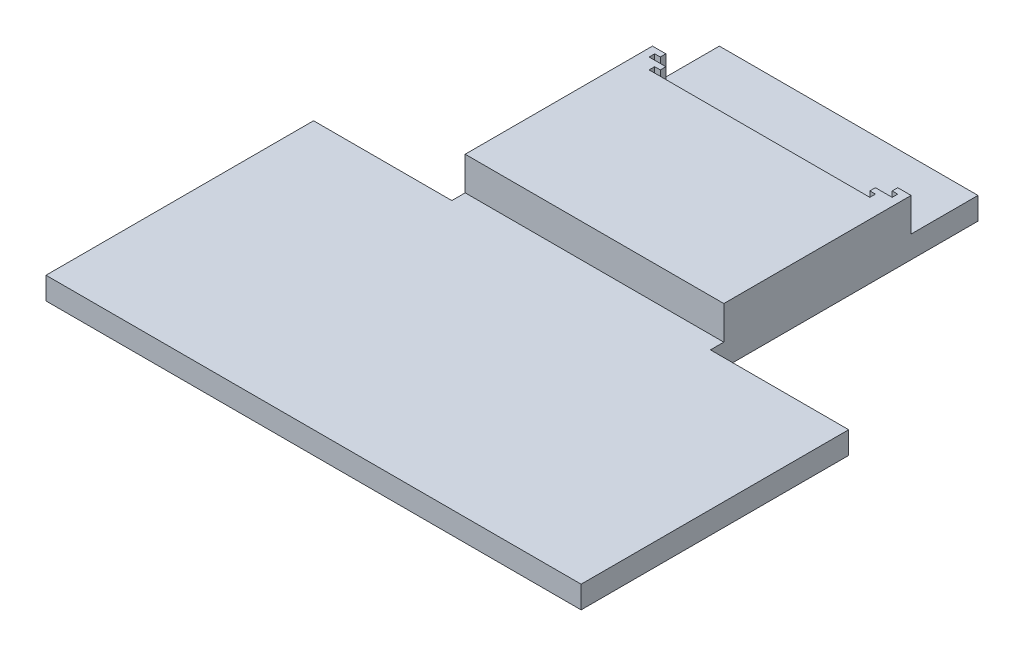
ISO-10303-21;
HEADER;
FILE_DESCRIPTION(('STEP AP214'),'2;1');
FILE_NAME('part.step','',(''),(''),'','','');
FILE_SCHEMA(('AUTOMOTIVE_DESIGN { 1 0 10303 214 1 1 1 1 }'));
ENDSEC;
DATA;
#1=APPLICATION_CONTEXT('core data for automotive mechanical design processes');
#2=APPLICATION_PROTOCOL_DEFINITION('international standard','automotive_design',2000,#1);
#3=PRODUCT_CONTEXT('',#1,'mechanical');
#4=PRODUCT('Part','Part','',(#3));
#5=PRODUCT_RELATED_PRODUCT_CATEGORY('part','',(#4));
#6=PRODUCT_DEFINITION_FORMATION('','',#4);
#7=PRODUCT_DEFINITION_CONTEXT('part definition',#1,'design');
#8=PRODUCT_DEFINITION('design','',#6,#7);
#9=PRODUCT_DEFINITION_SHAPE('','',#8);
#10=(LENGTH_UNIT() NAMED_UNIT(*) SI_UNIT(.MILLI.,.METRE.));
#11=(NAMED_UNIT(*) PLANE_ANGLE_UNIT() SI_UNIT($,.RADIAN.));
#12=(NAMED_UNIT(*) SI_UNIT($,.STERADIAN.) SOLID_ANGLE_UNIT());
#13=UNCERTAINTY_MEASURE_WITH_UNIT(LENGTH_MEASURE(1.E-05),#10,'distance_accuracy_value','');
#14=(GEOMETRIC_REPRESENTATION_CONTEXT(3) GLOBAL_UNCERTAINTY_ASSIGNED_CONTEXT((#13)) GLOBAL_UNIT_ASSIGNED_CONTEXT((#10,
#11,#12)) REPRESENTATION_CONTEXT('',''));
#15=CARTESIAN_POINT('',(0.,0.,0.));
#16=DIRECTION('',(0.,0.,1.));
#17=DIRECTION('',(1.,0.,0.));
#18=AXIS2_PLACEMENT_3D('',#15,#16,#17);
#19=CARTESIAN_POINT('',(-29.,10.,-45.));
#20=DIRECTION('',(0.,0.,1.));
#21=DIRECTION('',(1.,0.,0.));
#22=AXIS2_PLACEMENT_3D('',#19,#20,#21);
#23=PLANE('',#22);
#24=DIRECTION('',(-1.,0.,0.));
#25=VECTOR('',#24,1.);
#26=CARTESIAN_POINT('',(-29.,12.5,-45.));
#27=LINE('',#26,#25);
#28=CARTESIAN_POINT('',(-26.,12.5,-45.));
#29=VERTEX_POINT('',#28);
#30=CARTESIAN_POINT('',(-29.,12.5,-45.));
#31=VERTEX_POINT('',#30);
#32=EDGE_CURVE('E449',#29,#31,#27,.T.);
#33=ORIENTED_EDGE('',*,*,#32,.F.);
#34=DIRECTION('',(0.,1.,0.));
#35=VECTOR('',#34,1.);
#36=CARTESIAN_POINT('',(-26.,5.,-45.));
#37=LINE('',#36,#35);
#38=CARTESIAN_POINT('',(-26.,5.,-45.));
#39=VERTEX_POINT('',#38);
#40=EDGE_CURVE('E414',#39,#29,#37,.T.);
#41=ORIENTED_EDGE('',*,*,#40,.F.);
#42=DIRECTION('',(-1.,0.,0.));
#43=VECTOR('',#42,1.);
#44=CARTESIAN_POINT('',(-29.,5.,-45.));
#45=LINE('',#44,#43);
#46=CARTESIAN_POINT('',(-29.,5.,-45.));
#47=VERTEX_POINT('',#46);
#48=EDGE_CURVE('E504',#39,#47,#45,.T.);
#49=ORIENTED_EDGE('',*,*,#48,.T.);
#50=DIRECTION('',(0.,-1.,0.));
#51=VECTOR('',#50,1.);
#52=CARTESIAN_POINT('',(-29.,10.,-45.));
#53=LINE('',#52,#51);
#54=EDGE_CURVE('E509',#31,#47,#53,.T.);
#55=ORIENTED_EDGE('',*,*,#54,.F.);
#56=EDGE_LOOP('',(#33,#41,#49,#55));
#57=FACE_BOUND('',#56,.T.);
#58=ADVANCED_FACE('F45',(#57),#23,.F.);
#59=CARTESIAN_POINT('',(0.,5.,0.));
#60=DIRECTION('',(0.,1.,0.));
#61=DIRECTION('',(0.,0.,1.));
#62=AXIS2_PLACEMENT_3D('',#59,#60,#61);
#63=PLANE('',#62);
#64=CARTESIAN_POINT('',(29.,5.,-45.));
#65=VERTEX_POINT('',#64);
#66=CARTESIAN_POINT('',(26.,5.,-45.));
#67=VERTEX_POINT('',#66);
#68=EDGE_CURVE('E505',#65,#67,#45,.T.);
#69=ORIENTED_EDGE('',*,*,#68,.F.);
#70=DIRECTION('',(0.,0.,1.));
#71=VECTOR('',#70,1.);
#72=CARTESIAN_POINT('',(29.,5.,-60.));
#73=LINE('',#72,#71);
#74=CARTESIAN_POINT('',(29.,5.,-60.));
#75=VERTEX_POINT('',#74);
#76=EDGE_CURVE('E536',#75,#65,#73,.T.);
#77=ORIENTED_EDGE('',*,*,#76,.F.);
#78=DIRECTION('',(-1.,0.,0.));
#79=VECTOR('',#78,1.);
#80=CARTESIAN_POINT('',(60.,5.,-60.));
#81=LINE('',#80,#79);
#82=CARTESIAN_POINT('',(-29.,5.,-60.));
#83=VERTEX_POINT('',#82);
#84=EDGE_CURVE('E591',#75,#83,#81,.T.);
#85=ORIENTED_EDGE('',*,*,#84,.T.);
#86=DIRECTION('',(0.,0.,-1.));
#87=VECTOR('',#86,1.);
#88=CARTESIAN_POINT('',(-29.,5.,-60.));
#89=LINE('',#88,#87);
#90=EDGE_CURVE('E569',#47,#83,#89,.T.);
#91=ORIENTED_EDGE('',*,*,#90,.F.);
#92=ORIENTED_EDGE('',*,*,#48,.F.);
#93=DIRECTION('',(0.,0.,1.));
#94=VECTOR('',#93,1.);
#95=CARTESIAN_POINT('',(-26.,5.,-45.));
#96=LINE('',#95,#94);
#97=CARTESIAN_POINT('',(-26.,5.,-43.75));
#98=VERTEX_POINT('',#97);
#99=EDGE_CURVE('E313',#39,#98,#96,.T.);
#100=ORIENTED_EDGE('',*,*,#99,.T.);
#101=DIRECTION('',(-1.,0.,0.));
#102=VECTOR('',#101,1.);
#103=CARTESIAN_POINT('',(-26.,5.,-43.75));
#104=LINE('',#103,#102);
#105=CARTESIAN_POINT('',(-27.25,5.,-43.75));
#106=VERTEX_POINT('',#105);
#107=EDGE_CURVE('E317',#98,#106,#104,.T.);
#108=ORIENTED_EDGE('',*,*,#107,.T.);
#109=DIRECTION('',(0.,0.,1.));
#110=VECTOR('',#109,1.);
#111=CARTESIAN_POINT('',(-27.25,5.,-42.5));
#112=LINE('',#111,#110);
#113=CARTESIAN_POINT('',(-27.25,5.,-42.5));
#114=VERTEX_POINT('',#113);
#115=EDGE_CURVE('E321',#106,#114,#112,.T.);
#116=ORIENTED_EDGE('',*,*,#115,.T.);
#117=DIRECTION('',(1.,0.,0.));
#118=VECTOR('',#117,1.);
#119=CARTESIAN_POINT('',(-26.,5.,-42.5));
#120=LINE('',#119,#118);
#121=CARTESIAN_POINT('',(-23.5,5.,-42.5));
#122=VERTEX_POINT('',#121);
#123=EDGE_CURVE('E325',#114,#122,#120,.T.);
#124=ORIENTED_EDGE('',*,*,#123,.T.);
#125=DIRECTION('',(0.,0.,1.));
#126=VECTOR('',#125,1.);
#127=CARTESIAN_POINT('',(-23.5,5.,-41.25));
#128=LINE('',#127,#126);
#129=CARTESIAN_POINT('',(-23.5,5.,-41.25));
#130=VERTEX_POINT('',#129);
#131=EDGE_CURVE('E328',#122,#130,#128,.T.);
#132=ORIENTED_EDGE('',*,*,#131,.T.);
#133=DIRECTION('',(-1.,0.,0.));
#134=VECTOR('',#133,1.);
#135=CARTESIAN_POINT('',(-23.5,5.,-41.25));
#136=LINE('',#135,#134);
#137=CARTESIAN_POINT('',(-24.75,5.,-41.25));
#138=VERTEX_POINT('',#137);
#139=EDGE_CURVE('E332',#130,#138,#136,.T.);
#140=ORIENTED_EDGE('',*,*,#139,.T.);
#141=DIRECTION('',(0.,0.,1.));
#142=VECTOR('',#141,1.);
#143=CARTESIAN_POINT('',(-24.75,5.,-40.));
#144=LINE('',#143,#142);
#145=CARTESIAN_POINT('',(-24.75,5.,-40.));
#146=VERTEX_POINT('',#145);
#147=EDGE_CURVE('E283',#138,#146,#144,.T.);
#148=ORIENTED_EDGE('',*,*,#147,.T.);
#149=DIRECTION('',(1.,0.,0.));
#150=VECTOR('',#149,1.);
#151=CARTESIAN_POINT('',(-23.5,5.,-40.));
#152=LINE('',#151,#150);
#153=CARTESIAN_POINT('',(-21.,5.,-40.));
#154=VERTEX_POINT('',#153);
#155=EDGE_CURVE('E61',#146,#154,#152,.T.);
#156=ORIENTED_EDGE('',*,*,#155,.T.);
#157=CARTESIAN_POINT('',(21.,5.,-40.));
#158=VERTEX_POINT('',#157);
#159=EDGE_CURVE('E268',#154,#158,#152,.T.);
#160=ORIENTED_EDGE('',*,*,#159,.T.);
#161=CARTESIAN_POINT('',(24.75,5.,-40.));
#162=VERTEX_POINT('',#161);
#163=EDGE_CURVE('E261',#158,#162,#152,.T.);
#164=ORIENTED_EDGE('',*,*,#163,.T.);
#165=DIRECTION('',(0.,0.,-1.));
#166=VECTOR('',#165,1.);
#167=CARTESIAN_POINT('',(24.75,5.,-41.25));
#168=LINE('',#167,#166);
#169=CARTESIAN_POINT('',(24.75,5.,-41.25));
#170=VERTEX_POINT('',#169);
#171=EDGE_CURVE('E266',#162,#170,#168,.T.);
#172=ORIENTED_EDGE('',*,*,#171,.T.);
#173=DIRECTION('',(-1.,0.,0.));
#174=VECTOR('',#173,1.);
#175=CARTESIAN_POINT('',(23.5,5.,-41.25));
#176=LINE('',#175,#174);
#177=CARTESIAN_POINT('',(23.5,5.,-41.25));
#178=VERTEX_POINT('',#177);
#179=EDGE_CURVE('E288',#170,#178,#176,.T.);
#180=ORIENTED_EDGE('',*,*,#179,.T.);
#181=DIRECTION('',(0.,0.,-1.));
#182=VECTOR('',#181,1.);
#183=CARTESIAN_POINT('',(23.5,5.,-41.25));
#184=LINE('',#183,#182);
#185=CARTESIAN_POINT('',(23.5,5.,-42.5));
#186=VERTEX_POINT('',#185);
#187=EDGE_CURVE('E292',#178,#186,#184,.T.);
#188=ORIENTED_EDGE('',*,*,#187,.T.);
#189=DIRECTION('',(1.,0.,0.));
#190=VECTOR('',#189,1.);
#191=CARTESIAN_POINT('',(23.5,5.,-42.5));
#192=LINE('',#191,#190);
#193=CARTESIAN_POINT('',(27.25,5.,-42.5));
#194=VERTEX_POINT('',#193);
#195=EDGE_CURVE('E298',#186,#194,#192,.T.);
#196=ORIENTED_EDGE('',*,*,#195,.T.);
#197=DIRECTION('',(0.,0.,-1.));
#198=VECTOR('',#197,1.);
#199=CARTESIAN_POINT('',(27.25,5.,-43.75));
#200=LINE('',#199,#198);
#201=CARTESIAN_POINT('',(27.25,5.,-43.75));
#202=VERTEX_POINT('',#201);
#203=EDGE_CURVE('E301',#194,#202,#200,.T.);
#204=ORIENTED_EDGE('',*,*,#203,.T.);
#205=DIRECTION('',(-1.,0.,0.));
#206=VECTOR('',#205,1.);
#207=CARTESIAN_POINT('',(26.,5.,-43.75));
#208=LINE('',#207,#206);
#209=CARTESIAN_POINT('',(26.,5.,-43.75));
#210=VERTEX_POINT('',#209);
#211=EDGE_CURVE('E305',#202,#210,#208,.T.);
#212=ORIENTED_EDGE('',*,*,#211,.T.);
#213=DIRECTION('',(0.,0.,-1.));
#214=VECTOR('',#213,1.);
#215=CARTESIAN_POINT('',(26.,5.,-45.));
#216=LINE('',#215,#214);
#217=EDGE_CURVE('E309',#210,#67,#216,.T.);
#218=ORIENTED_EDGE('',*,*,#217,.T.);
#219=EDGE_LOOP('',(#69,#77,#85,#91,#92,#100,#108,#116,#124,#132,#140,#148,#156,#160,#164,#172,
#180,#188,#196,#204,#212,#218));
#220=FACE_BOUND('',#219,.T.);
#221=ADVANCED_FACE('F263',(#220),#63,.T.);
#222=CARTESIAN_POINT('',(-60.,5.,60.));
#223=DIRECTION('',(1.,0.,0.));
#224=DIRECTION('',(0.,0.,-1.));
#225=AXIS2_PLACEMENT_3D('',#222,#223,#224);
#226=PLANE('',#225);
#227=DIRECTION('',(0.,0.,1.));
#228=VECTOR('',#227,1.);
#229=CARTESIAN_POINT('',(-60.,5.,60.));
#230=LINE('',#229,#228);
#231=CARTESIAN_POINT('',(-60.,5.,0.));
#232=VERTEX_POINT('',#231);
#233=CARTESIAN_POINT('',(-60.,5.,60.));
#234=VERTEX_POINT('',#233);
#235=EDGE_CURVE('E580',#232,#234,#230,.T.);
#236=ORIENTED_EDGE('',*,*,#235,.F.);
#237=DIRECTION('',(0.,1.,0.));
#238=VECTOR('',#237,1.);
#239=CARTESIAN_POINT('',(-60.,0.,0.));
#240=LINE('',#239,#238);
#241=CARTESIAN_POINT('',(-60.,0.,0.));
#242=VERTEX_POINT('',#241);
#243=EDGE_CURVE('E554',#242,#232,#240,.T.);
#244=ORIENTED_EDGE('',*,*,#243,.F.);
#245=DIRECTION('',(0.,0.,1.));
#246=VECTOR('',#245,1.);
#247=CARTESIAN_POINT('',(-60.,0.,60.));
#248=LINE('',#247,#246);
#249=CARTESIAN_POINT('',(-60.,0.,60.));
#250=VERTEX_POINT('',#249);
#251=EDGE_CURVE('E547',#242,#250,#248,.T.);
#252=ORIENTED_EDGE('',*,*,#251,.T.);
#253=DIRECTION('',(0.,-1.,0.));
#254=VECTOR('',#253,1.);
#255=CARTESIAN_POINT('',(-60.,5.,60.));
#256=LINE('',#255,#254);
#257=EDGE_CURVE('E11',#234,#250,#256,.T.);
#258=ORIENTED_EDGE('',*,*,#257,.F.);
#259=EDGE_LOOP('',(#236,#244,#252,#258));
#260=FACE_BOUND('',#259,.T.);
#261=ADVANCED_FACE('F47',(#260),#226,.F.);
#262=CARTESIAN_POINT('',(60.,5.,60.));
#263=DIRECTION('',(0.,0.,-1.));
#264=DIRECTION('',(-1.,0.,0.));
#265=AXIS2_PLACEMENT_3D('',#262,#263,#264);
#266=PLANE('',#265);
#267=DIRECTION('',(1.,0.,0.));
#268=VECTOR('',#267,1.);
#269=CARTESIAN_POINT('',(60.,0.,60.));
#270=LINE('',#269,#268);
#271=CARTESIAN_POINT('',(60.,0.,60.));
#272=VERTEX_POINT('',#271);
#273=EDGE_CURVE('E597',#250,#272,#270,.T.);
#274=ORIENTED_EDGE('',*,*,#273,.T.);
#275=DIRECTION('',(0.,-1.,0.));
#276=VECTOR('',#275,1.);
#277=CARTESIAN_POINT('',(60.,5.,60.));
#278=LINE('',#277,#276);
#279=CARTESIAN_POINT('',(60.,5.,60.));
#280=VERTEX_POINT('',#279);
#281=EDGE_CURVE('E54',#280,#272,#278,.T.);
#282=ORIENTED_EDGE('',*,*,#281,.F.);
#283=DIRECTION('',(1.,0.,0.));
#284=VECTOR('',#283,1.);
#285=CARTESIAN_POINT('',(60.,5.,60.));
#286=LINE('',#285,#284);
#287=EDGE_CURVE('E583',#234,#280,#286,.T.);
#288=ORIENTED_EDGE('',*,*,#287,.F.);
#289=ORIENTED_EDGE('',*,*,#257,.T.);
#290=EDGE_LOOP('',(#274,#282,#288,#289));
#291=FACE_BOUND('',#290,.T.);
#292=ADVANCED_FACE('F1046',(#291),#266,.F.);
#293=CARTESIAN_POINT('',(60.,5.,60.));
#294=DIRECTION('',(-1.,0.,0.));
#295=DIRECTION('',(0.,0.,1.));
#296=AXIS2_PLACEMENT_3D('',#293,#294,#295);
#297=PLANE('',#296);
#298=DIRECTION('',(0.,0.,-1.));
#299=VECTOR('',#298,1.);
#300=CARTESIAN_POINT('',(60.,0.,60.));
#301=LINE('',#300,#299);
#302=CARTESIAN_POINT('',(60.,0.,0.));
#303=VERTEX_POINT('',#302);
#304=EDGE_CURVE('E600',#272,#303,#301,.T.);
#305=ORIENTED_EDGE('',*,*,#304,.T.);
#306=DIRECTION('',(0.,1.,0.));
#307=VECTOR('',#306,1.);
#308=CARTESIAN_POINT('',(60.,0.,0.));
#309=LINE('',#308,#307);
#310=CARTESIAN_POINT('',(60.,5.,0.));
#311=VERTEX_POINT('',#310);
#312=EDGE_CURVE('E543',#303,#311,#309,.T.);
#313=ORIENTED_EDGE('',*,*,#312,.T.);
#314=DIRECTION('',(0.,0.,-1.));
#315=VECTOR('',#314,1.);
#316=CARTESIAN_POINT('',(60.,5.,60.));
#317=LINE('',#316,#315);
#318=EDGE_CURVE('E587',#280,#311,#317,.T.);
#319=ORIENTED_EDGE('',*,*,#318,.F.);
#320=ORIENTED_EDGE('',*,*,#281,.T.);
#321=EDGE_LOOP('',(#305,#313,#319,#320));
#322=FACE_BOUND('',#321,.T.);
#323=ADVANCED_FACE('F612',(#322),#297,.F.);
#324=CARTESIAN_POINT('',(60.,5.,-60.));
#325=DIRECTION('',(0.,0.,1.));
#326=DIRECTION('',(1.,0.,0.));
#327=AXIS2_PLACEMENT_3D('',#324,#325,#326);
#328=PLANE('',#327);
#329=ORIENTED_EDGE('',*,*,#84,.F.);
#330=DIRECTION('',(0.,1.,0.));
#331=VECTOR('',#330,1.);
#332=CARTESIAN_POINT('',(29.,0.,-60.));
#333=LINE('',#332,#331);
#334=CARTESIAN_POINT('',(29.,0.,-60.));
#335=VERTEX_POINT('',#334);
#336=EDGE_CURVE('E535',#335,#75,#333,.T.);
#337=ORIENTED_EDGE('',*,*,#336,.F.);
#338=DIRECTION('',(-1.,0.,0.));
#339=VECTOR('',#338,1.);
#340=CARTESIAN_POINT('',(60.,0.,-60.));
#341=LINE('',#340,#339);
#342=CARTESIAN_POINT('',(-29.,0.,-60.));
#343=VERTEX_POINT('',#342);
#344=EDGE_CURVE('E584',#335,#343,#341,.T.);
#345=ORIENTED_EDGE('',*,*,#344,.T.);
#346=DIRECTION('',(0.,1.,0.));
#347=VECTOR('',#346,1.);
#348=CARTESIAN_POINT('',(-29.,0.,-60.));
#349=LINE('',#348,#347);
#350=EDGE_CURVE('E525',#343,#83,#349,.T.);
#351=ORIENTED_EDGE('',*,*,#350,.T.);
#352=EDGE_LOOP('',(#329,#337,#345,#351));
#353=FACE_BOUND('',#352,.T.);
#354=ADVANCED_FACE('F704',(#353),#328,.F.);
#355=DIRECTION('',(1.,0.,0.));
#356=VECTOR('',#355,1.);
#357=CARTESIAN_POINT('',(-29.,5.,-2.99999999999997));
#358=LINE('',#357,#356);
#359=CARTESIAN_POINT('',(-29.,5.,-2.99999999999997));
#360=VERTEX_POINT('',#359);
#361=CARTESIAN_POINT('',(29.,5.,-2.99999999999997));
#362=VERTEX_POINT('',#361);
#363=EDGE_CURVE('E500',#360,#362,#358,.T.);
#364=ORIENTED_EDGE('',*,*,#363,.F.);
#365=CARTESIAN_POINT('',(-29.,5.,0.));
#366=VERTEX_POINT('',#365);
#367=EDGE_CURVE('E564',#366,#360,#89,.T.);
#368=ORIENTED_EDGE('',*,*,#367,.F.);
#369=DIRECTION('',(1.,0.,0.));
#370=VECTOR('',#369,1.);
#371=CARTESIAN_POINT('',(-60.,5.,0.));
#372=LINE('',#371,#370);
#373=EDGE_CURVE('E568',#232,#366,#372,.T.);
#374=ORIENTED_EDGE('',*,*,#373,.F.);
#375=ORIENTED_EDGE('',*,*,#235,.T.);
#376=ORIENTED_EDGE('',*,*,#287,.T.);
#377=ORIENTED_EDGE('',*,*,#318,.T.);
#378=DIRECTION('',(1.,0.,0.));
#379=VECTOR('',#378,1.);
#380=CARTESIAN_POINT('',(60.,5.,0.));
#381=LINE('',#380,#379);
#382=CARTESIAN_POINT('',(29.,5.,0.));
#383=VERTEX_POINT('',#382);
#384=EDGE_CURVE('E531',#383,#311,#381,.T.);
#385=ORIENTED_EDGE('',*,*,#384,.F.);
#386=EDGE_CURVE('E540',#362,#383,#73,.T.);
#387=ORIENTED_EDGE('',*,*,#386,.F.);
#388=EDGE_LOOP('',(#364,#368,#374,#375,#376,#377,#385,#387));
#389=FACE_BOUND('',#388,.T.);
#390=ADVANCED_FACE('F711',(#389),#63,.T.);
#391=CARTESIAN_POINT('',(0.,0.,0.));
#392=DIRECTION('',(0.,1.,0.));
#393=DIRECTION('',(0.,0.,1.));
#394=AXIS2_PLACEMENT_3D('',#391,#392,#393);
#395=PLANE('',#394);
#396=DIRECTION('',(0.,0.,1.));
#397=VECTOR('',#396,1.);
#398=CARTESIAN_POINT('',(29.,0.,-60.));
#399=LINE('',#398,#397);
#400=CARTESIAN_POINT('',(29.,0.,0.));
#401=VERTEX_POINT('',#400);
#402=EDGE_CURVE('E526',#335,#401,#399,.T.);
#403=ORIENTED_EDGE('',*,*,#402,.T.);
#404=DIRECTION('',(1.,0.,0.));
#405=VECTOR('',#404,1.);
#406=CARTESIAN_POINT('',(60.,0.,0.));
#407=LINE('',#406,#405);
#408=EDGE_CURVE('E530',#401,#303,#407,.T.);
#409=ORIENTED_EDGE('',*,*,#408,.T.);
#410=ORIENTED_EDGE('',*,*,#304,.F.);
#411=ORIENTED_EDGE('',*,*,#273,.F.);
#412=ORIENTED_EDGE('',*,*,#251,.F.);
#413=DIRECTION('',(1.,0.,0.));
#414=VECTOR('',#413,1.);
#415=CARTESIAN_POINT('',(-60.,0.,0.));
#416=LINE('',#415,#414);
#417=CARTESIAN_POINT('',(-29.,0.,0.));
#418=VERTEX_POINT('',#417);
#419=EDGE_CURVE('E576',#242,#418,#416,.T.);
#420=ORIENTED_EDGE('',*,*,#419,.T.);
#421=DIRECTION('',(0.,0.,-1.));
#422=VECTOR('',#421,1.);
#423=CARTESIAN_POINT('',(-29.,0.,-60.));
#424=LINE('',#423,#422);
#425=EDGE_CURVE('E557',#418,#343,#424,.T.);
#426=ORIENTED_EDGE('',*,*,#425,.T.);
#427=ORIENTED_EDGE('',*,*,#344,.F.);
#428=EDGE_LOOP('',(#403,#409,#410,#411,#412,#420,#426,#427));
#429=FACE_BOUND('',#428,.T.);
#430=ADVANCED_FACE('F617',(#429),#395,.F.);
#431=CARTESIAN_POINT('',(-29.,0.,-60.));
#432=DIRECTION('',(1.,0.,0.));
#433=DIRECTION('',(0.,0.,-1.));
#434=AXIS2_PLACEMENT_3D('',#431,#432,#433);
#435=PLANE('',#434);
#436=ORIENTED_EDGE('',*,*,#367,.T.);
#437=DIRECTION('',(0.,-1.,0.));
#438=VECTOR('',#437,1.);
#439=CARTESIAN_POINT('',(-29.,10.,-2.99999999999997));
#440=LINE('',#439,#438);
#441=CARTESIAN_POINT('',(-29.,12.5,-2.99999999999997));
#442=VERTEX_POINT('',#441);
#443=EDGE_CURVE('E521',#442,#360,#440,.T.);
#444=ORIENTED_EDGE('',*,*,#443,.F.);
#445=DIRECTION('',(0.,0.,1.));
#446=VECTOR('',#445,1.);
#447=CARTESIAN_POINT('',(-29.,12.5,-45.));
#448=LINE('',#447,#446);
#449=EDGE_CURVE('E395',#31,#442,#448,.T.);
#450=ORIENTED_EDGE('',*,*,#449,.F.);
#451=ORIENTED_EDGE('',*,*,#54,.T.);
#452=ORIENTED_EDGE('',*,*,#90,.T.);
#453=ORIENTED_EDGE('',*,*,#350,.F.);
#454=ORIENTED_EDGE('',*,*,#425,.F.);
#455=DIRECTION('',(0.,1.,0.));
#456=VECTOR('',#455,1.);
#457=CARTESIAN_POINT('',(-29.,0.,0.));
#458=LINE('',#457,#456);
#459=EDGE_CURVE('E558',#418,#366,#458,.T.);
#460=ORIENTED_EDGE('',*,*,#459,.T.);
#461=EDGE_LOOP('',(#436,#444,#450,#451,#452,#453,#454,#460));
#462=FACE_BOUND('',#461,.T.);
#463=ADVANCED_FACE('F647',(#462),#435,.F.);
#464=CARTESIAN_POINT('',(-60.,0.,0.));
#465=DIRECTION('',(0.,0.,1.));
#466=DIRECTION('',(1.,0.,0.));
#467=AXIS2_PLACEMENT_3D('',#464,#465,#466);
#468=PLANE('',#467);
#469=ORIENTED_EDGE('',*,*,#373,.T.);
#470=ORIENTED_EDGE('',*,*,#459,.F.);
#471=ORIENTED_EDGE('',*,*,#419,.F.);
#472=ORIENTED_EDGE('',*,*,#243,.T.);
#473=EDGE_LOOP('',(#469,#470,#471,#472));
#474=FACE_BOUND('',#473,.T.);
#475=ADVANCED_FACE('F707',(#474),#468,.F.);
#476=CARTESIAN_POINT('',(60.,0.,0.));
#477=DIRECTION('',(0.,0.,1.));
#478=DIRECTION('',(1.,0.,0.));
#479=AXIS2_PLACEMENT_3D('',#476,#477,#478);
#480=PLANE('',#479);
#481=ORIENTED_EDGE('',*,*,#384,.T.);
#482=ORIENTED_EDGE('',*,*,#312,.F.);
#483=ORIENTED_EDGE('',*,*,#408,.F.);
#484=DIRECTION('',(0.,1.,0.));
#485=VECTOR('',#484,1.);
#486=CARTESIAN_POINT('',(29.,0.,0.));
#487=LINE('',#486,#485);
#488=EDGE_CURVE('E548',#401,#383,#487,.T.);
#489=ORIENTED_EDGE('',*,*,#488,.T.);
#490=EDGE_LOOP('',(#481,#482,#483,#489));
#491=FACE_BOUND('',#490,.T.);
#492=ADVANCED_FACE('F622',(#491),#480,.F.);
#493=CARTESIAN_POINT('',(29.,0.,-60.));
#494=DIRECTION('',(-1.,0.,0.));
#495=DIRECTION('',(0.,0.,1.));
#496=AXIS2_PLACEMENT_3D('',#493,#494,#495);
#497=PLANE('',#496);
#498=ORIENTED_EDGE('',*,*,#76,.T.);
#499=DIRECTION('',(0.,-1.,0.));
#500=VECTOR('',#499,1.);
#501=CARTESIAN_POINT('',(29.,10.,-45.));
#502=LINE('',#501,#500);
#503=CARTESIAN_POINT('',(29.,12.5,-45.));
#504=VERTEX_POINT('',#503);
#505=EDGE_CURVE('E513',#504,#65,#502,.T.);
#506=ORIENTED_EDGE('',*,*,#505,.F.);
#507=DIRECTION('',(0.,0.,-1.));
#508=VECTOR('',#507,1.);
#509=CARTESIAN_POINT('',(29.,12.5,-45.));
#510=LINE('',#509,#508);
#511=CARTESIAN_POINT('',(29.,12.5,-2.99999999999997));
#512=VERTEX_POINT('',#511);
#513=EDGE_CURVE('E445',#512,#504,#510,.T.);
#514=ORIENTED_EDGE('',*,*,#513,.F.);
#515=DIRECTION('',(0.,-1.,0.));
#516=VECTOR('',#515,1.);
#517=CARTESIAN_POINT('',(29.,10.,-2.99999999999997));
#518=LINE('',#517,#516);
#519=EDGE_CURVE('E517',#512,#362,#518,.T.);
#520=ORIENTED_EDGE('',*,*,#519,.T.);
#521=ORIENTED_EDGE('',*,*,#386,.T.);
#522=ORIENTED_EDGE('',*,*,#488,.F.);
#523=ORIENTED_EDGE('',*,*,#402,.F.);
#524=ORIENTED_EDGE('',*,*,#336,.T.);
#525=EDGE_LOOP('',(#498,#506,#514,#520,#521,#522,#523,#524));
#526=FACE_BOUND('',#525,.T.);
#527=ADVANCED_FACE('F625',(#526),#497,.F.);
#528=CARTESIAN_POINT('',(-29.,10.,-2.99999999999997));
#529=DIRECTION('',(0.,0.,-1.));
#530=DIRECTION('',(-1.,0.,0.));
#531=AXIS2_PLACEMENT_3D('',#528,#529,#530);
#532=PLANE('',#531);
#533=ORIENTED_EDGE('',*,*,#363,.T.);
#534=ORIENTED_EDGE('',*,*,#519,.F.);
#535=DIRECTION('',(1.,0.,0.));
#536=VECTOR('',#535,1.);
#537=CARTESIAN_POINT('',(-29.,12.5,-2.99999999999997));
#538=LINE('',#537,#536);
#539=EDGE_CURVE('E441',#442,#512,#538,.T.);
#540=ORIENTED_EDGE('',*,*,#539,.F.);
#541=ORIENTED_EDGE('',*,*,#443,.T.);
#542=EDGE_LOOP('',(#533,#534,#540,#541));
#543=FACE_BOUND('',#542,.T.);
#544=ADVANCED_FACE('F651',(#543),#532,.F.);
#545=ORIENTED_EDGE('',*,*,#68,.T.);
#546=DIRECTION('',(0.,1.,0.));
#547=VECTOR('',#546,1.);
#548=CARTESIAN_POINT('',(26.,5.,-45.));
#549=LINE('',#548,#547);
#550=CARTESIAN_POINT('',(26.,12.5,-45.));
#551=VERTEX_POINT('',#550);
#552=EDGE_CURVE('E417',#67,#551,#549,.T.);
#553=ORIENTED_EDGE('',*,*,#552,.T.);
#554=EDGE_CURVE('E450',#504,#551,#27,.T.);
#555=ORIENTED_EDGE('',*,*,#554,.F.);
#556=ORIENTED_EDGE('',*,*,#505,.T.);
#557=EDGE_LOOP('',(#545,#553,#555,#556));
#558=FACE_BOUND('',#557,.T.);
#559=ADVANCED_FACE('F655',(#558),#23,.F.);
#560=CARTESIAN_POINT('',(0.,12.5,0.));
#561=DIRECTION('',(0.,1.,0.));
#562=DIRECTION('',(0.,0.,1.));
#563=AXIS2_PLACEMENT_3D('',#560,#561,#562);
#564=PLANE('',#563);
#565=DIRECTION('',(0.,0.,1.));
#566=VECTOR('',#565,1.);
#567=CARTESIAN_POINT('',(-26.,12.5,-45.));
#568=LINE('',#567,#566);
#569=CARTESIAN_POINT('',(-26.,12.5,-43.75));
#570=VERTEX_POINT('',#569);
#571=EDGE_CURVE('E366',#29,#570,#568,.T.);
#572=ORIENTED_EDGE('',*,*,#571,.F.);
#573=ORIENTED_EDGE('',*,*,#32,.T.);
#574=ORIENTED_EDGE('',*,*,#449,.T.);
#575=ORIENTED_EDGE('',*,*,#539,.T.);
#576=ORIENTED_EDGE('',*,*,#513,.T.);
#577=ORIENTED_EDGE('',*,*,#554,.T.);
#578=DIRECTION('',(0.,0.,-1.));
#579=VECTOR('',#578,1.);
#580=CARTESIAN_POINT('',(26.,12.5,-45.));
#581=LINE('',#580,#579);
#582=CARTESIAN_POINT('',(26.,12.5,-43.75));
#583=VERTEX_POINT('',#582);
#584=EDGE_CURVE('E363',#583,#551,#581,.T.);
#585=ORIENTED_EDGE('',*,*,#584,.F.);
#586=DIRECTION('',(-1.,0.,0.));
#587=VECTOR('',#586,1.);
#588=CARTESIAN_POINT('',(26.,12.5,-43.75));
#589=LINE('',#588,#587);
#590=CARTESIAN_POINT('',(27.25,12.5,-43.75));
#591=VERTEX_POINT('',#590);
#592=EDGE_CURVE('E359',#591,#583,#589,.T.);
#593=ORIENTED_EDGE('',*,*,#592,.F.);
#594=DIRECTION('',(0.,0.,-1.));
#595=VECTOR('',#594,1.);
#596=CARTESIAN_POINT('',(27.25,12.5,-43.75));
#597=LINE('',#596,#595);
#598=CARTESIAN_POINT('',(27.25,12.5,-42.5));
#599=VERTEX_POINT('',#598);
#600=EDGE_CURVE('E355',#599,#591,#597,.T.);
#601=ORIENTED_EDGE('',*,*,#600,.F.);
#602=DIRECTION('',(1.,0.,0.));
#603=VECTOR('',#602,1.);
#604=CARTESIAN_POINT('',(26.,12.5,-42.5));
#605=LINE('',#604,#603);
#606=CARTESIAN_POINT('',(23.5,12.5,-42.5));
#607=VERTEX_POINT('',#606);
#608=EDGE_CURVE('E351',#607,#599,#605,.T.);
#609=ORIENTED_EDGE('',*,*,#608,.F.);
#610=DIRECTION('',(0.,0.,-1.));
#611=VECTOR('',#610,1.);
#612=CARTESIAN_POINT('',(23.5,12.5,-41.25));
#613=LINE('',#612,#611);
#614=CARTESIAN_POINT('',(23.5,12.5,-41.25));
#615=VERTEX_POINT('',#614);
#616=EDGE_CURVE('E347',#615,#607,#613,.T.);
#617=ORIENTED_EDGE('',*,*,#616,.F.);
#618=DIRECTION('',(-1.,0.,0.));
#619=VECTOR('',#618,1.);
#620=CARTESIAN_POINT('',(23.5,12.5,-41.25));
#621=LINE('',#620,#619);
#622=CARTESIAN_POINT('',(24.75,12.5,-41.25));
#623=VERTEX_POINT('',#622);
#624=EDGE_CURVE('E343',#623,#615,#621,.T.);
#625=ORIENTED_EDGE('',*,*,#624,.F.);
#626=DIRECTION('',(0.,0.,-1.));
#627=VECTOR('',#626,1.);
#628=CARTESIAN_POINT('',(24.75,12.5,-41.25));
#629=LINE('',#628,#627);
#630=CARTESIAN_POINT('',(24.75,12.5,-40.));
#631=VERTEX_POINT('',#630);
#632=EDGE_CURVE('E340',#631,#623,#629,.T.);
#633=ORIENTED_EDGE('',*,*,#632,.F.);
#634=DIRECTION('',(1.,0.,0.));
#635=VECTOR('',#634,1.);
#636=CARTESIAN_POINT('',(23.5,12.5,-40.));
#637=LINE('',#636,#635);
#638=CARTESIAN_POINT('',(-24.75,12.5,-39.9999999999997));
#639=VERTEX_POINT('',#638);
#640=EDGE_CURVE('E277',#639,#631,#637,.T.);
#641=ORIENTED_EDGE('',*,*,#640,.F.);
#642=DIRECTION('',(0.,0.,1.));
#643=VECTOR('',#642,1.);
#644=CARTESIAN_POINT('',(-24.75,12.5,-40.));
#645=LINE('',#644,#643);
#646=CARTESIAN_POINT('',(-24.75,12.5,-41.25));
#647=VERTEX_POINT('',#646);
#648=EDGE_CURVE('E69',#647,#639,#645,.T.);
#649=ORIENTED_EDGE('',*,*,#648,.F.);
#650=DIRECTION('',(-1.,0.,0.));
#651=VECTOR('',#650,1.);
#652=CARTESIAN_POINT('',(-23.5,12.5,-41.25));
#653=LINE('',#652,#651);
#654=CARTESIAN_POINT('',(-23.5,12.5,-41.25));
#655=VERTEX_POINT('',#654);
#656=EDGE_CURVE('E386',#655,#647,#653,.T.);
#657=ORIENTED_EDGE('',*,*,#656,.F.);
#658=DIRECTION('',(0.,0.,1.));
#659=VECTOR('',#658,1.);
#660=CARTESIAN_POINT('',(-23.5,12.5,-41.25));
#661=LINE('',#660,#659);
#662=CARTESIAN_POINT('',(-23.5,12.5,-42.5));
#663=VERTEX_POINT('',#662);
#664=EDGE_CURVE('E382',#663,#655,#661,.T.);
#665=ORIENTED_EDGE('',*,*,#664,.F.);
#666=DIRECTION('',(1.,0.,0.));
#667=VECTOR('',#666,1.);
#668=CARTESIAN_POINT('',(-26.,12.5,-42.5));
#669=LINE('',#668,#667);
#670=CARTESIAN_POINT('',(-27.25,12.5,-42.5));
#671=VERTEX_POINT('',#670);
#672=EDGE_CURVE('E378',#671,#663,#669,.T.);
#673=ORIENTED_EDGE('',*,*,#672,.F.);
#674=DIRECTION('',(0.,0.,1.));
#675=VECTOR('',#674,1.);
#676=CARTESIAN_POINT('',(-27.25,12.5,-42.5));
#677=LINE('',#676,#675);
#678=CARTESIAN_POINT('',(-27.25,12.5,-43.75));
#679=VERTEX_POINT('',#678);
#680=EDGE_CURVE('E374',#679,#671,#677,.T.);
#681=ORIENTED_EDGE('',*,*,#680,.F.);
#682=DIRECTION('',(-1.,0.,0.));
#683=VECTOR('',#682,1.);
#684=CARTESIAN_POINT('',(-26.,12.5,-43.75));
#685=LINE('',#684,#683);
#686=EDGE_CURVE('E370',#570,#679,#685,.T.);
#687=ORIENTED_EDGE('',*,*,#686,.F.);
#688=EDGE_LOOP('',(#572,#573,#574,#575,#576,#577,#585,#593,#601,#609,#617,#625,#633,#641,#649,
#657,#665,#673,#681,#687));
#689=FACE_BOUND('',#688,.T.);
#690=ADVANCED_FACE('F639',(#689),#564,.T.);
#691=CARTESIAN_POINT('',(-24.75,5.,-40.));
#692=DIRECTION('',(-1.,0.,0.));
#693=DIRECTION('',(0.,0.,1.));
#694=AXIS2_PLACEMENT_3D('',#691,#692,#693);
#695=PLANE('',#694);
#696=ORIENTED_EDGE('',*,*,#648,.T.);
#697=DIRECTION('',(0.,1.,0.));
#698=VECTOR('',#697,1.);
#699=CARTESIAN_POINT('',(-24.75,5.,-40.));
#700=LINE('',#699,#698);
#701=EDGE_CURVE('E392',#146,#639,#700,.T.);
#702=ORIENTED_EDGE('',*,*,#701,.F.);
#703=ORIENTED_EDGE('',*,*,#147,.F.);
#704=DIRECTION('',(0.,1.,0.));
#705=VECTOR('',#704,1.);
#706=CARTESIAN_POINT('',(-24.75,5.,-41.25));
#707=LINE('',#706,#705);
#708=EDGE_CURVE('E396',#138,#647,#707,.T.);
#709=ORIENTED_EDGE('',*,*,#708,.T.);
#710=EDGE_LOOP('',(#696,#702,#703,#709));
#711=FACE_BOUND('',#710,.T.);
#712=ADVANCED_FACE('F735',(#711),#695,.F.);
#713=CARTESIAN_POINT('',(-23.5,5.,-41.25));
#714=DIRECTION('',(0.,0.,-1.));
#715=DIRECTION('',(-1.,0.,0.));
#716=AXIS2_PLACEMENT_3D('',#713,#714,#715);
#717=PLANE('',#716);
#718=ORIENTED_EDGE('',*,*,#656,.T.);
#719=ORIENTED_EDGE('',*,*,#708,.F.);
#720=ORIENTED_EDGE('',*,*,#139,.F.);
#721=DIRECTION('',(0.,1.,0.));
#722=VECTOR('',#721,1.);
#723=CARTESIAN_POINT('',(-23.5,5.,-41.25));
#724=LINE('',#723,#722);
#725=EDGE_CURVE('E399',#130,#655,#724,.T.);
#726=ORIENTED_EDGE('',*,*,#725,.T.);
#727=EDGE_LOOP('',(#718,#719,#720,#726));
#728=FACE_BOUND('',#727,.T.);
#729=ADVANCED_FACE('F684',(#728),#717,.F.);
#730=CARTESIAN_POINT('',(-23.5,5.,-41.25));
#731=DIRECTION('',(-1.,0.,0.));
#732=DIRECTION('',(0.,0.,1.));
#733=AXIS2_PLACEMENT_3D('',#730,#731,#732);
#734=PLANE('',#733);
#735=ORIENTED_EDGE('',*,*,#664,.T.);
#736=ORIENTED_EDGE('',*,*,#725,.F.);
#737=ORIENTED_EDGE('',*,*,#131,.F.);
#738=DIRECTION('',(0.,1.,0.));
#739=VECTOR('',#738,1.);
#740=CARTESIAN_POINT('',(-23.5,5.,-42.5));
#741=LINE('',#740,#739);
#742=EDGE_CURVE('E402',#122,#663,#741,.T.);
#743=ORIENTED_EDGE('',*,*,#742,.T.);
#744=EDGE_LOOP('',(#735,#736,#737,#743));
#745=FACE_BOUND('',#744,.T.);
#746=ADVANCED_FACE('F688',(#745),#734,.F.);
#747=CARTESIAN_POINT('',(-26.,5.,-42.5));
#748=DIRECTION('',(0.,0.,1.));
#749=DIRECTION('',(1.,0.,0.));
#750=AXIS2_PLACEMENT_3D('',#747,#748,#749);
#751=PLANE('',#750);
#752=ORIENTED_EDGE('',*,*,#672,.T.);
#753=ORIENTED_EDGE('',*,*,#742,.F.);
#754=ORIENTED_EDGE('',*,*,#123,.F.);
#755=DIRECTION('',(0.,1.,0.));
#756=VECTOR('',#755,1.);
#757=CARTESIAN_POINT('',(-27.25,5.,-42.5));
#758=LINE('',#757,#756);
#759=EDGE_CURVE('E405',#114,#671,#758,.T.);
#760=ORIENTED_EDGE('',*,*,#759,.T.);
#761=EDGE_LOOP('',(#752,#753,#754,#760));
#762=FACE_BOUND('',#761,.T.);
#763=ADVANCED_FACE('F692',(#762),#751,.F.);
#764=CARTESIAN_POINT('',(-27.25,5.,-42.5));
#765=DIRECTION('',(-1.,0.,0.));
#766=DIRECTION('',(0.,0.,1.));
#767=AXIS2_PLACEMENT_3D('',#764,#765,#766);
#768=PLANE('',#767);
#769=ORIENTED_EDGE('',*,*,#680,.T.);
#770=ORIENTED_EDGE('',*,*,#759,.F.);
#771=ORIENTED_EDGE('',*,*,#115,.F.);
#772=DIRECTION('',(0.,1.,0.));
#773=VECTOR('',#772,1.);
#774=CARTESIAN_POINT('',(-27.25,5.,-43.75));
#775=LINE('',#774,#773);
#776=EDGE_CURVE('E408',#106,#679,#775,.T.);
#777=ORIENTED_EDGE('',*,*,#776,.T.);
#778=EDGE_LOOP('',(#769,#770,#771,#777));
#779=FACE_BOUND('',#778,.T.);
#780=ADVANCED_FACE('F695',(#779),#768,.F.);
#781=CARTESIAN_POINT('',(-26.,5.,-43.75));
#782=DIRECTION('',(0.,0.,-1.));
#783=DIRECTION('',(-1.,0.,0.));
#784=AXIS2_PLACEMENT_3D('',#781,#782,#783);
#785=PLANE('',#784);
#786=ORIENTED_EDGE('',*,*,#686,.T.);
#787=ORIENTED_EDGE('',*,*,#776,.F.);
#788=ORIENTED_EDGE('',*,*,#107,.F.);
#789=DIRECTION('',(0.,1.,0.));
#790=VECTOR('',#789,1.);
#791=CARTESIAN_POINT('',(-26.,5.,-43.75));
#792=LINE('',#791,#790);
#793=EDGE_CURVE('E411',#98,#570,#792,.T.);
#794=ORIENTED_EDGE('',*,*,#793,.T.);
#795=EDGE_LOOP('',(#786,#787,#788,#794));
#796=FACE_BOUND('',#795,.T.);
#797=ADVANCED_FACE('F699',(#796),#785,.F.);
#798=CARTESIAN_POINT('',(-26.,5.,-45.));
#799=DIRECTION('',(-1.,0.,0.));
#800=DIRECTION('',(0.,0.,1.));
#801=AXIS2_PLACEMENT_3D('',#798,#799,#800);
#802=PLANE('',#801);
#803=ORIENTED_EDGE('',*,*,#571,.T.);
#804=ORIENTED_EDGE('',*,*,#793,.F.);
#805=ORIENTED_EDGE('',*,*,#99,.F.);
#806=ORIENTED_EDGE('',*,*,#40,.T.);
#807=EDGE_LOOP('',(#803,#804,#805,#806));
#808=FACE_BOUND('',#807,.T.);
#809=ADVANCED_FACE('F701',(#808),#802,.F.);
#810=CARTESIAN_POINT('',(26.,5.,-45.));
#811=DIRECTION('',(1.,0.,0.));
#812=DIRECTION('',(0.,0.,-1.));
#813=AXIS2_PLACEMENT_3D('',#810,#811,#812);
#814=PLANE('',#813);
#815=ORIENTED_EDGE('',*,*,#584,.T.);
#816=ORIENTED_EDGE('',*,*,#552,.F.);
#817=ORIENTED_EDGE('',*,*,#217,.F.);
#818=DIRECTION('',(0.,1.,0.));
#819=VECTOR('',#818,1.);
#820=CARTESIAN_POINT('',(26.,5.,-43.75));
#821=LINE('',#820,#819);
#822=EDGE_CURVE('E421',#210,#583,#821,.T.);
#823=ORIENTED_EDGE('',*,*,#822,.T.);
#824=EDGE_LOOP('',(#815,#816,#817,#823));
#825=FACE_BOUND('',#824,.T.);
#826=ADVANCED_FACE('F660',(#825),#814,.F.);
#827=CARTESIAN_POINT('',(26.,5.,-43.75));
#828=DIRECTION('',(0.,0.,-1.));
#829=DIRECTION('',(-1.,0.,0.));
#830=AXIS2_PLACEMENT_3D('',#827,#828,#829);
#831=PLANE('',#830);
#832=ORIENTED_EDGE('',*,*,#592,.T.);
#833=ORIENTED_EDGE('',*,*,#822,.F.);
#834=ORIENTED_EDGE('',*,*,#211,.F.);
#835=DIRECTION('',(0.,1.,0.));
#836=VECTOR('',#835,1.);
#837=CARTESIAN_POINT('',(27.25,5.,-43.75));
#838=LINE('',#837,#836);
#839=EDGE_CURVE('E424',#202,#591,#838,.T.);
#840=ORIENTED_EDGE('',*,*,#839,.T.);
#841=EDGE_LOOP('',(#832,#833,#834,#840));
#842=FACE_BOUND('',#841,.T.);
#843=ADVANCED_FACE('F664',(#842),#831,.F.);
#844=CARTESIAN_POINT('',(27.25,5.,-43.75));
#845=DIRECTION('',(1.,0.,0.));
#846=DIRECTION('',(0.,0.,-1.));
#847=AXIS2_PLACEMENT_3D('',#844,#845,#846);
#848=PLANE('',#847);
#849=ORIENTED_EDGE('',*,*,#600,.T.);
#850=ORIENTED_EDGE('',*,*,#839,.F.);
#851=ORIENTED_EDGE('',*,*,#203,.F.);
#852=DIRECTION('',(0.,1.,0.));
#853=VECTOR('',#852,1.);
#854=CARTESIAN_POINT('',(27.25,5.,-42.5));
#855=LINE('',#854,#853);
#856=EDGE_CURVE('E427',#194,#599,#855,.T.);
#857=ORIENTED_EDGE('',*,*,#856,.T.);
#858=EDGE_LOOP('',(#849,#850,#851,#857));
#859=FACE_BOUND('',#858,.T.);
#860=ADVANCED_FACE('F667',(#859),#848,.F.);
#861=CARTESIAN_POINT('',(26.,5.,-42.5));
#862=DIRECTION('',(0.,0.,1.));
#863=DIRECTION('',(1.,0.,0.));
#864=AXIS2_PLACEMENT_3D('',#861,#862,#863);
#865=PLANE('',#864);
#866=ORIENTED_EDGE('',*,*,#608,.T.);
#867=ORIENTED_EDGE('',*,*,#856,.F.);
#868=ORIENTED_EDGE('',*,*,#195,.F.);
#869=DIRECTION('',(0.,1.,0.));
#870=VECTOR('',#869,1.);
#871=CARTESIAN_POINT('',(23.5,5.,-42.5));
#872=LINE('',#871,#870);
#873=EDGE_CURVE('E430',#186,#607,#872,.T.);
#874=ORIENTED_EDGE('',*,*,#873,.T.);
#875=EDGE_LOOP('',(#866,#867,#868,#874));
#876=FACE_BOUND('',#875,.T.);
#877=ADVANCED_FACE('F673',(#876),#865,.F.);
#878=CARTESIAN_POINT('',(23.5,5.,-41.25));
#879=DIRECTION('',(1.,0.,0.));
#880=DIRECTION('',(0.,0.,-1.));
#881=AXIS2_PLACEMENT_3D('',#878,#879,#880);
#882=PLANE('',#881);
#883=ORIENTED_EDGE('',*,*,#616,.T.);
#884=ORIENTED_EDGE('',*,*,#873,.F.);
#885=ORIENTED_EDGE('',*,*,#187,.F.);
#886=DIRECTION('',(0.,1.,0.));
#887=VECTOR('',#886,1.);
#888=CARTESIAN_POINT('',(23.5,5.,-41.25));
#889=LINE('',#888,#887);
#890=EDGE_CURVE('E433',#178,#615,#889,.T.);
#891=ORIENTED_EDGE('',*,*,#890,.T.);
#892=EDGE_LOOP('',(#883,#884,#885,#891));
#893=FACE_BOUND('',#892,.T.);
#894=ADVANCED_FACE('F677',(#893),#882,.F.);
#895=CARTESIAN_POINT('',(23.5,5.,-41.25));
#896=DIRECTION('',(0.,0.,-1.));
#897=DIRECTION('',(-1.,0.,0.));
#898=AXIS2_PLACEMENT_3D('',#895,#896,#897);
#899=PLANE('',#898);
#900=ORIENTED_EDGE('',*,*,#624,.T.);
#901=ORIENTED_EDGE('',*,*,#890,.F.);
#902=ORIENTED_EDGE('',*,*,#179,.F.);
#903=DIRECTION('',(0.,1.,0.));
#904=VECTOR('',#903,1.);
#905=CARTESIAN_POINT('',(24.75,5.,-41.25));
#906=LINE('',#905,#904);
#907=EDGE_CURVE('E282',#170,#623,#906,.T.);
#908=ORIENTED_EDGE('',*,*,#907,.T.);
#909=EDGE_LOOP('',(#900,#901,#902,#908));
#910=FACE_BOUND('',#909,.T.);
#911=ADVANCED_FACE('F679',(#910),#899,.F.);
#912=CARTESIAN_POINT('',(24.75,5.,-41.25));
#913=DIRECTION('',(1.,0.,0.));
#914=DIRECTION('',(0.,0.,-1.));
#915=AXIS2_PLACEMENT_3D('',#912,#913,#914);
#916=PLANE('',#915);
#917=ORIENTED_EDGE('',*,*,#632,.T.);
#918=ORIENTED_EDGE('',*,*,#907,.F.);
#919=ORIENTED_EDGE('',*,*,#171,.F.);
#920=DIRECTION('',(0.,1.,0.));
#921=VECTOR('',#920,1.);
#922=CARTESIAN_POINT('',(24.75,5.,-40.));
#923=LINE('',#922,#921);
#924=EDGE_CURVE('E274',#162,#631,#923,.T.);
#925=ORIENTED_EDGE('',*,*,#924,.T.);
#926=EDGE_LOOP('',(#917,#918,#919,#925));
#927=FACE_BOUND('',#926,.T.);
#928=ADVANCED_FACE('F285',(#927),#916,.F.);
#929=CARTESIAN_POINT('',(23.5,5.,-40.));
#930=DIRECTION('',(0.,0.,1.));
#931=DIRECTION('',(1.,0.,0.));
#932=AXIS2_PLACEMENT_3D('',#929,#930,#931);
#933=PLANE('',#932);
#934=DIRECTION('',(0.,-1.,0.));
#935=VECTOR('',#934,1.);
#936=CARTESIAN_POINT('',(-21.,10.,-40.));
#937=LINE('',#936,#935);
#938=CARTESIAN_POINT('',(-21.,10.,-40.));
#939=VERTEX_POINT('',#938);
#940=EDGE_CURVE('E486',#939,#154,#937,.T.);
#941=ORIENTED_EDGE('',*,*,#940,.T.);
#942=ORIENTED_EDGE('',*,*,#155,.F.);
#943=ORIENTED_EDGE('',*,*,#701,.T.);
#944=ORIENTED_EDGE('',*,*,#640,.T.);
#945=ORIENTED_EDGE('',*,*,#924,.F.);
#946=ORIENTED_EDGE('',*,*,#163,.F.);
#947=DIRECTION('',(0.,-1.,0.));
#948=VECTOR('',#947,1.);
#949=CARTESIAN_POINT('',(21.,10.,-40.));
#950=LINE('',#949,#948);
#951=CARTESIAN_POINT('',(21.,10.,-40.));
#952=VERTEX_POINT('',#951);
#953=EDGE_CURVE('E490',#952,#158,#950,.T.);
#954=ORIENTED_EDGE('',*,*,#953,.F.);
#955=DIRECTION('',(-1.,0.,0.));
#956=VECTOR('',#955,1.);
#957=CARTESIAN_POINT('',(21.,10.,-40.));
#958=LINE('',#957,#956);
#959=EDGE_CURVE('E482',#952,#939,#958,.T.);
#960=ORIENTED_EDGE('',*,*,#959,.T.);
#961=EDGE_LOOP('',(#941,#942,#943,#944,#945,#946,#954,#960));
#962=FACE_BOUND('',#961,.T.);
#963=ADVANCED_FACE('F275',(#962),#933,.F.);
#964=CARTESIAN_POINT('',(0.,2.5,0.));
#965=DIRECTION('',(0.,1.,0.));
#966=DIRECTION('',(0.,0.,1.));
#967=AXIS2_PLACEMENT_3D('',#964,#965,#966);
#968=PLANE('',#967);
#969=DIRECTION('',(0.,0.,1.));
#970=VECTOR('',#969,1.);
#971=CARTESIAN_POINT('',(-21.,2.5,-8.));
#972=LINE('',#971,#970);
#973=CARTESIAN_POINT('',(-21.,2.5,-40.));
#974=VERTEX_POINT('',#973);
#975=CARTESIAN_POINT('',(-21.,2.5,-8.));
#976=VERTEX_POINT('',#975);
#977=EDGE_CURVE('E454',#974,#976,#972,.T.);
#978=ORIENTED_EDGE('',*,*,#977,.T.);
#979=DIRECTION('',(1.,0.,0.));
#980=VECTOR('',#979,1.);
#981=CARTESIAN_POINT('',(21.,2.5,-8.));
#982=LINE('',#981,#980);
#983=CARTESIAN_POINT('',(21.,2.5,-8.));
#984=VERTEX_POINT('',#983);
#985=EDGE_CURVE('E458',#976,#984,#982,.T.);
#986=ORIENTED_EDGE('',*,*,#985,.T.);
#987=DIRECTION('',(0.,0.,-1.));
#988=VECTOR('',#987,1.);
#989=CARTESIAN_POINT('',(21.,2.5,-8.));
#990=LINE('',#989,#988);
#991=CARTESIAN_POINT('',(21.,2.5,-40.));
#992=VERTEX_POINT('',#991);
#993=EDGE_CURVE('E462',#984,#992,#990,.T.);
#994=ORIENTED_EDGE('',*,*,#993,.T.);
#995=DIRECTION('',(-1.,0.,0.));
#996=VECTOR('',#995,1.);
#997=CARTESIAN_POINT('',(21.,2.5,-40.));
#998=LINE('',#997,#996);
#999=EDGE_CURVE('E466',#992,#974,#998,.T.);
#1000=ORIENTED_EDGE('',*,*,#999,.T.);
#1001=EDGE_LOOP('',(#978,#986,#994,#1000));
#1002=FACE_BOUND('',#1001,.T.);
#1003=ADVANCED_FACE('F753',(#1002),#968,.T.);
#1004=CARTESIAN_POINT('',(21.,10.,-8.));
#1005=DIRECTION('',(-1.,0.,0.));
#1006=DIRECTION('',(0.,0.,1.));
#1007=AXIS2_PLACEMENT_3D('',#1004,#1005,#1006);
#1008=PLANE('',#1007);
#1009=ORIENTED_EDGE('',*,*,#953,.T.);
#1010=EDGE_CURVE('E489',#158,#992,#950,.T.);
#1011=ORIENTED_EDGE('',*,*,#1010,.T.);
#1012=ORIENTED_EDGE('',*,*,#993,.F.);
#1013=DIRECTION('',(0.,-1.,0.));
#1014=VECTOR('',#1013,1.);
#1015=CARTESIAN_POINT('',(21.,10.,-8.));
#1016=LINE('',#1015,#1014);
#1017=CARTESIAN_POINT('',(21.,10.,-8.));
#1018=VERTEX_POINT('',#1017);
#1019=EDGE_CURVE('E494',#1018,#984,#1016,.T.);
#1020=ORIENTED_EDGE('',*,*,#1019,.F.);
#1021=DIRECTION('',(0.,0.,-1.));
#1022=VECTOR('',#1021,1.);
#1023=CARTESIAN_POINT('',(21.,10.,-8.));
#1024=LINE('',#1023,#1022);
#1025=EDGE_CURVE('E478',#1018,#952,#1024,.T.);
#1026=ORIENTED_EDGE('',*,*,#1025,.T.);
#1027=EDGE_LOOP('',(#1009,#1011,#1012,#1020,#1026));
#1028=FACE_BOUND('',#1027,.T.);
#1029=ADVANCED_FACE('F942',(#1028),#1008,.T.);
#1030=CARTESIAN_POINT('',(21.,10.,-40.));
#1031=DIRECTION('',(0.,0.,1.));
#1032=DIRECTION('',(1.,0.,0.));
#1033=AXIS2_PLACEMENT_3D('',#1030,#1031,#1032);
#1034=PLANE('',#1033);
#1035=ORIENTED_EDGE('',*,*,#159,.F.);
#1036=EDGE_CURVE('E485',#154,#974,#937,.T.);
#1037=ORIENTED_EDGE('',*,*,#1036,.T.);
#1038=ORIENTED_EDGE('',*,*,#999,.F.);
#1039=ORIENTED_EDGE('',*,*,#1010,.F.);
#1040=EDGE_LOOP('',(#1035,#1037,#1038,#1039));
#1041=FACE_BOUND('',#1040,.T.);
#1042=ADVANCED_FACE('F946',(#1041),#1034,.T.);
#1043=CARTESIAN_POINT('',(-21.,10.,-8.));
#1044=DIRECTION('',(1.,0.,0.));
#1045=DIRECTION('',(0.,0.,-1.));
#1046=AXIS2_PLACEMENT_3D('',#1043,#1044,#1045);
#1047=PLANE('',#1046);
#1048=DIRECTION('',(0.,-1.,0.));
#1049=VECTOR('',#1048,1.);
#1050=CARTESIAN_POINT('',(-21.,10.,-8.));
#1051=LINE('',#1050,#1049);
#1052=CARTESIAN_POINT('',(-21.,10.,-8.));
#1053=VERTEX_POINT('',#1052);
#1054=EDGE_CURVE('E497',#1053,#976,#1051,.T.);
#1055=ORIENTED_EDGE('',*,*,#1054,.T.);
#1056=ORIENTED_EDGE('',*,*,#977,.F.);
#1057=ORIENTED_EDGE('',*,*,#1036,.F.);
#1058=ORIENTED_EDGE('',*,*,#940,.F.);
#1059=DIRECTION('',(0.,0.,1.));
#1060=VECTOR('',#1059,1.);
#1061=CARTESIAN_POINT('',(-21.,10.,-8.));
#1062=LINE('',#1061,#1060);
#1063=EDGE_CURVE('E470',#939,#1053,#1062,.T.);
#1064=ORIENTED_EDGE('',*,*,#1063,.T.);
#1065=EDGE_LOOP('',(#1055,#1056,#1057,#1058,#1064));
#1066=FACE_BOUND('',#1065,.T.);
#1067=ADVANCED_FACE('F955',(#1066),#1047,.T.);
#1068=CARTESIAN_POINT('',(21.,10.,-8.));
#1069=DIRECTION('',(0.,0.,-1.));
#1070=DIRECTION('',(-1.,0.,0.));
#1071=AXIS2_PLACEMENT_3D('',#1068,#1069,#1070);
#1072=PLANE('',#1071);
#1073=ORIENTED_EDGE('',*,*,#1019,.T.);
#1074=ORIENTED_EDGE('',*,*,#985,.F.);
#1075=ORIENTED_EDGE('',*,*,#1054,.F.);
#1076=DIRECTION('',(1.,0.,0.));
#1077=VECTOR('',#1076,1.);
#1078=CARTESIAN_POINT('',(21.,10.,-8.));
#1079=LINE('',#1078,#1077);
#1080=EDGE_CURVE('E474',#1053,#1018,#1079,.T.);
#1081=ORIENTED_EDGE('',*,*,#1080,.T.);
#1082=EDGE_LOOP('',(#1073,#1074,#1075,#1081));
#1083=FACE_BOUND('',#1082,.T.);
#1084=ADVANCED_FACE('F790',(#1083),#1072,.T.);
#1085=CARTESIAN_POINT('',(0.,10.,0.));
#1086=DIRECTION('',(0.,1.,0.));
#1087=DIRECTION('',(0.,0.,1.));
#1088=AXIS2_PLACEMENT_3D('',#1085,#1086,#1087);
#1089=PLANE('',#1088);
#1090=ORIENTED_EDGE('',*,*,#1080,.F.);
#1091=ORIENTED_EDGE('',*,*,#1063,.F.);
#1092=ORIENTED_EDGE('',*,*,#959,.F.);
#1093=ORIENTED_EDGE('',*,*,#1025,.F.);
#1094=EDGE_LOOP('',(#1090,#1091,#1092,#1093));
#1095=FACE_BOUND('',#1094,.T.);
#1096=ADVANCED_FACE('F785',(#1095),#1089,.F.);
#1097=CLOSED_SHELL('',(#58,#221,#261,#292,#323,#354,#390,#430,#463,#475,#492,#527,#544,#559,
#690,#712,#729,#746,#763,#780,#797,#809,#826,#843,#860,#877,#894,#911,#928,#963,#1003,#1029,
#1042,#1067,#1084,#1096));
#1098=MANIFOLD_SOLID_BREP('B2',#1097);
#1099=ADVANCED_BREP_SHAPE_REPRESENTATION('',(#18,#1098),#14);
#1100=SHAPE_DEFINITION_REPRESENTATION(#9,#1099);
ENDSEC;
END-ISO-10303-21;
